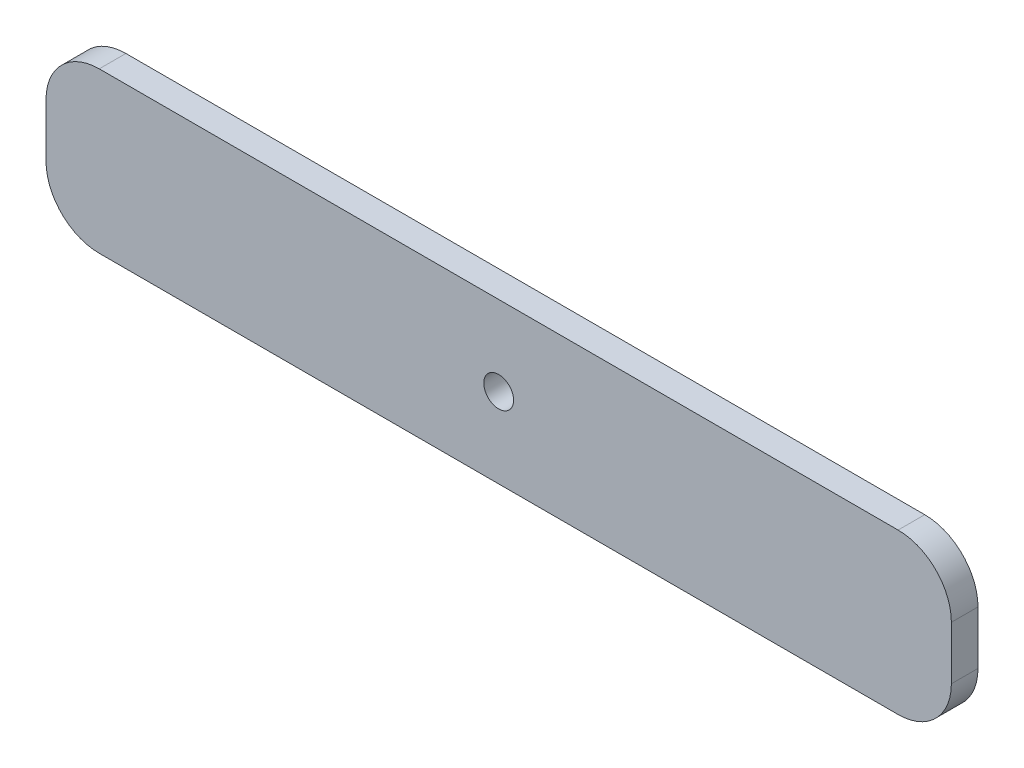
ISO-10303-21;
HEADER;
FILE_DESCRIPTION(('STEP AP214'),'2;1');
FILE_NAME('part.step','',(''),(''),'','','');
FILE_SCHEMA(('AUTOMOTIVE_DESIGN { 1 0 10303 214 1 1 1 1 }'));
ENDSEC;
DATA;
#1=APPLICATION_CONTEXT('core data for automotive mechanical design processes');
#2=APPLICATION_PROTOCOL_DEFINITION('international standard','automotive_design',2000,#1);
#3=PRODUCT_CONTEXT('',#1,'mechanical');
#4=PRODUCT('Part','Part','',(#3));
#5=PRODUCT_RELATED_PRODUCT_CATEGORY('part','',(#4));
#6=PRODUCT_DEFINITION_FORMATION('','',#4);
#7=PRODUCT_DEFINITION_CONTEXT('part definition',#1,'design');
#8=PRODUCT_DEFINITION('design','',#6,#7);
#9=PRODUCT_DEFINITION_SHAPE('','',#8);
#10=(LENGTH_UNIT() NAMED_UNIT(*) SI_UNIT(.MILLI.,.METRE.));
#11=(NAMED_UNIT(*) PLANE_ANGLE_UNIT() SI_UNIT($,.RADIAN.));
#12=(NAMED_UNIT(*) SI_UNIT($,.STERADIAN.) SOLID_ANGLE_UNIT());
#13=UNCERTAINTY_MEASURE_WITH_UNIT(LENGTH_MEASURE(1.E-05),#10,'distance_accuracy_value','');
#14=(GEOMETRIC_REPRESENTATION_CONTEXT(3) GLOBAL_UNCERTAINTY_ASSIGNED_CONTEXT((#13)) GLOBAL_UNIT_ASSIGNED_CONTEXT((#10,
#11,#12)) REPRESENTATION_CONTEXT('',''));
#15=CARTESIAN_POINT('',(0.,0.,0.));
#16=DIRECTION('',(0.,0.,1.));
#17=DIRECTION('',(1.,0.,0.));
#18=AXIS2_PLACEMENT_3D('',#15,#16,#17);
#19=CARTESIAN_POINT('',(10.,-20.,5.));
#20=DIRECTION('',(0.,0.,1.));
#21=DIRECTION('',(1.,0.,0.));
#22=AXIS2_PLACEMENT_3D('',#19,#20,#21);
#23=PLANE('',#22);
#24=CARTESIAN_POINT('',(10.,-20.,5.));
#25=DIRECTION('',(0.,0.,1.));
#26=DIRECTION('',(1.,0.,0.));
#27=AXIS2_PLACEMENT_3D('',#24,#25,#26);
#28=CIRCLE('',#27,10.);
#29=CARTESIAN_POINT('',(0.,-20.,5.));
#30=VERTEX_POINT('',#29);
#31=CARTESIAN_POINT('',(10.,-30.,5.));
#32=VERTEX_POINT('',#31);
#33=EDGE_CURVE('E164',#30,#32,#28,.T.);
#34=ORIENTED_EDGE('',*,*,#33,.T.);
#35=DIRECTION('',(1.,0.,0.));
#36=VECTOR('',#35,1.);
#37=CARTESIAN_POINT('',(10.,-30.,5.));
#38=LINE('',#37,#36);
#39=CARTESIAN_POINT('',(160.,-30.,5.));
#40=VERTEX_POINT('',#39);
#41=EDGE_CURVE('E100',#32,#40,#38,.T.);
#42=ORIENTED_EDGE('',*,*,#41,.T.);
#43=CARTESIAN_POINT('',(160.,-20.,5.));
#44=DIRECTION('',(0.,0.,1.));
#45=DIRECTION('',(1.,0.,0.));
#46=AXIS2_PLACEMENT_3D('',#43,#44,#45);
#47=CIRCLE('',#46,9.99999999999997);
#48=CARTESIAN_POINT('',(170.,-20.,5.));
#49=VERTEX_POINT('',#48);
#50=EDGE_CURVE('E185',#40,#49,#47,.T.);
#51=ORIENTED_EDGE('',*,*,#50,.T.);
#52=DIRECTION('',(0.,1.,0.));
#53=VECTOR('',#52,1.);
#54=CARTESIAN_POINT('',(170.,-10.,5.));
#55=LINE('',#54,#53);
#56=CARTESIAN_POINT('',(170.,-10.,5.));
#57=VERTEX_POINT('',#56);
#58=EDGE_CURVE('E199',#49,#57,#55,.T.);
#59=ORIENTED_EDGE('',*,*,#58,.T.);
#60=CARTESIAN_POINT('',(160.,-10.,5.));
#61=DIRECTION('',(0.,0.,1.));
#62=DIRECTION('',(1.,0.,0.));
#63=AXIS2_PLACEMENT_3D('',#60,#61,#62);
#64=CIRCLE('',#63,10.);
#65=CARTESIAN_POINT('',(160.,0.,5.));
#66=VERTEX_POINT('',#65);
#67=EDGE_CURVE('E119',#57,#66,#64,.T.);
#68=ORIENTED_EDGE('',*,*,#67,.T.);
#69=DIRECTION('',(-1.,0.,0.));
#70=VECTOR('',#69,1.);
#71=CARTESIAN_POINT('',(10.0000000000001,0.,5.));
#72=LINE('',#71,#70);
#73=CARTESIAN_POINT('',(10.0000000000001,0.,5.));
#74=VERTEX_POINT('',#73);
#75=EDGE_CURVE('E113',#66,#74,#72,.T.);
#76=ORIENTED_EDGE('',*,*,#75,.T.);
#77=CARTESIAN_POINT('',(10.,-10.,5.));
#78=DIRECTION('',(0.,0.,1.));
#79=DIRECTION('',(-1.,0.,0.));
#80=AXIS2_PLACEMENT_3D('',#77,#78,#79);
#81=CIRCLE('',#80,10.);
#82=CARTESIAN_POINT('',(0.,-10.0000000000001,5.));
#83=VERTEX_POINT('',#82);
#84=EDGE_CURVE('E117',#74,#83,#81,.T.);
#85=ORIENTED_EDGE('',*,*,#84,.T.);
#86=DIRECTION('',(0.,-1.,0.));
#87=VECTOR('',#86,1.);
#88=CARTESIAN_POINT('',(0.,-10.0000000000001,5.));
#89=LINE('',#88,#87);
#90=EDGE_CURVE('E57',#83,#30,#89,.T.);
#91=ORIENTED_EDGE('',*,*,#90,.T.);
#92=EDGE_LOOP('',(#34,#42,#51,#59,#68,#76,#85,#91));
#93=FACE_BOUND('',#92,.T.);
#94=CARTESIAN_POINT('',(85.,-15.,5.));
#95=DIRECTION('',(0.,0.,1.));
#96=DIRECTION('',(1.,0.,0.));
#97=AXIS2_PLACEMENT_3D('',#94,#95,#96);
#98=CIRCLE('',#97,2.79999999999999);
#99=CARTESIAN_POINT('',(87.8,-15.,5.));
#100=VERTEX_POINT('',#99);
#101=EDGE_CURVE('E146',#100,#100,#98,.T.);
#102=ORIENTED_EDGE('',*,*,#101,.F.);
#103=EDGE_LOOP('',(#102));
#104=FACE_BOUND('',#103,.T.);
#105=ADVANCED_FACE('F39',(#93,#104),#23,.T.);
#106=CARTESIAN_POINT('',(10.,-20.,0.));
#107=DIRECTION('',(0.,0.,1.));
#108=DIRECTION('',(1.,0.,0.));
#109=AXIS2_PLACEMENT_3D('',#106,#107,#108);
#110=PLANE('',#109);
#111=CARTESIAN_POINT('',(10.,-20.,0.));
#112=DIRECTION('',(0.,0.,1.));
#113=DIRECTION('',(1.,0.,0.));
#114=AXIS2_PLACEMENT_3D('',#111,#112,#113);
#115=CIRCLE('',#114,10.);
#116=CARTESIAN_POINT('',(0.,-20.,0.));
#117=VERTEX_POINT('',#116);
#118=CARTESIAN_POINT('',(10.,-30.,0.));
#119=VERTEX_POINT('',#118);
#120=EDGE_CURVE('E141',#117,#119,#115,.T.);
#121=ORIENTED_EDGE('',*,*,#120,.F.);
#122=DIRECTION('',(0.,-1.,0.));
#123=VECTOR('',#122,1.);
#124=CARTESIAN_POINT('',(0.,-10.0000000000001,0.));
#125=LINE('',#124,#123);
#126=CARTESIAN_POINT('',(0.,-10.0000000000001,0.));
#127=VERTEX_POINT('',#126);
#128=EDGE_CURVE('E92',#127,#117,#125,.T.);
#129=ORIENTED_EDGE('',*,*,#128,.F.);
#130=CARTESIAN_POINT('',(10.,-10.,0.));
#131=DIRECTION('',(0.,0.,1.));
#132=DIRECTION('',(-1.,0.,0.));
#133=AXIS2_PLACEMENT_3D('',#130,#131,#132);
#134=CIRCLE('',#133,10.);
#135=CARTESIAN_POINT('',(10.0000000000001,0.,0.));
#136=VERTEX_POINT('',#135);
#137=EDGE_CURVE('E86',#136,#127,#134,.T.);
#138=ORIENTED_EDGE('',*,*,#137,.F.);
#139=DIRECTION('',(-1.,0.,0.));
#140=VECTOR('',#139,1.);
#141=CARTESIAN_POINT('',(10.0000000000001,0.,0.));
#142=LINE('',#141,#140);
#143=CARTESIAN_POINT('',(160.,0.,0.));
#144=VERTEX_POINT('',#143);
#145=EDGE_CURVE('E128',#144,#136,#142,.T.);
#146=ORIENTED_EDGE('',*,*,#145,.F.);
#147=CARTESIAN_POINT('',(160.,-10.,0.));
#148=DIRECTION('',(0.,0.,1.));
#149=DIRECTION('',(1.,0.,0.));
#150=AXIS2_PLACEMENT_3D('',#147,#148,#149);
#151=CIRCLE('',#150,10.);
#152=CARTESIAN_POINT('',(170.,-10.,0.));
#153=VERTEX_POINT('',#152);
#154=EDGE_CURVE('E155',#153,#144,#151,.T.);
#155=ORIENTED_EDGE('',*,*,#154,.F.);
#156=DIRECTION('',(0.,1.,0.));
#157=VECTOR('',#156,1.);
#158=CARTESIAN_POINT('',(170.,-10.,0.));
#159=LINE('',#158,#157);
#160=CARTESIAN_POINT('',(170.,-20.,0.));
#161=VERTEX_POINT('',#160);
#162=EDGE_CURVE('E152',#161,#153,#159,.T.);
#163=ORIENTED_EDGE('',*,*,#162,.F.);
#164=CARTESIAN_POINT('',(160.,-20.,0.));
#165=DIRECTION('',(0.,0.,1.));
#166=DIRECTION('',(1.,0.,0.));
#167=AXIS2_PLACEMENT_3D('',#164,#165,#166);
#168=CIRCLE('',#167,9.99999999999997);
#169=CARTESIAN_POINT('',(160.,-30.,0.));
#170=VERTEX_POINT('',#169);
#171=EDGE_CURVE('E149',#170,#161,#168,.T.);
#172=ORIENTED_EDGE('',*,*,#171,.F.);
#173=DIRECTION('',(1.,0.,0.));
#174=VECTOR('',#173,1.);
#175=CARTESIAN_POINT('',(10.,-30.,0.));
#176=LINE('',#175,#174);
#177=EDGE_CURVE('E145',#119,#170,#176,.T.);
#178=ORIENTED_EDGE('',*,*,#177,.F.);
#179=EDGE_LOOP('',(#121,#129,#138,#146,#155,#163,#172,#178));
#180=FACE_BOUND('',#179,.T.);
#181=CARTESIAN_POINT('',(85.,-15.,0.));
#182=DIRECTION('',(0.,0.,1.));
#183=DIRECTION('',(1.,0.,0.));
#184=AXIS2_PLACEMENT_3D('',#181,#182,#183);
#185=CIRCLE('',#184,2.79999999999999);
#186=CARTESIAN_POINT('',(87.8,-15.,0.));
#187=VERTEX_POINT('',#186);
#188=EDGE_CURVE('E209',#187,#187,#185,.T.);
#189=ORIENTED_EDGE('',*,*,#188,.T.);
#190=EDGE_LOOP('',(#189));
#191=FACE_BOUND('',#190,.T.);
#192=ADVANCED_FACE('F189',(#180,#191),#110,.F.);
#193=CARTESIAN_POINT('',(10.,-20.,5.));
#194=DIRECTION('',(0.,0.,-1.));
#195=DIRECTION('',(-1.,0.,0.));
#196=AXIS2_PLACEMENT_3D('',#193,#194,#195);
#197=CYLINDRICAL_SURFACE('',#196,10.);
#198=ORIENTED_EDGE('',*,*,#120,.T.);
#199=DIRECTION('',(0.,0.,-1.));
#200=VECTOR('',#199,1.);
#201=CARTESIAN_POINT('',(10.,-30.,5.));
#202=LINE('',#201,#200);
#203=EDGE_CURVE('E11',#32,#119,#202,.T.);
#204=ORIENTED_EDGE('',*,*,#203,.F.);
#205=ORIENTED_EDGE('',*,*,#33,.F.);
#206=DIRECTION('',(0.,0.,-1.));
#207=VECTOR('',#206,1.);
#208=CARTESIAN_POINT('',(0.,-20.,5.));
#209=LINE('',#208,#207);
#210=EDGE_CURVE('E137',#30,#117,#209,.T.);
#211=ORIENTED_EDGE('',*,*,#210,.T.);
#212=EDGE_LOOP('',(#198,#204,#205,#211));
#213=FACE_BOUND('',#212,.T.);
#214=ADVANCED_FACE('F41',(#213),#197,.T.);
#215=CARTESIAN_POINT('',(10.,-30.,5.));
#216=DIRECTION('',(0.,1.,0.));
#217=DIRECTION('',(-1.,0.,0.));
#218=AXIS2_PLACEMENT_3D('',#215,#216,#217);
#219=PLANE('',#218);
#220=ORIENTED_EDGE('',*,*,#177,.T.);
#221=DIRECTION('',(0.,0.,-1.));
#222=VECTOR('',#221,1.);
#223=CARTESIAN_POINT('',(160.,-30.,5.));
#224=LINE('',#223,#222);
#225=EDGE_CURVE('E49',#40,#170,#224,.T.);
#226=ORIENTED_EDGE('',*,*,#225,.F.);
#227=ORIENTED_EDGE('',*,*,#41,.F.);
#228=ORIENTED_EDGE('',*,*,#203,.T.);
#229=EDGE_LOOP('',(#220,#226,#227,#228));
#230=FACE_BOUND('',#229,.T.);
#231=ADVANCED_FACE('F239',(#230),#219,.F.);
#232=CARTESIAN_POINT('',(160.,-20.,5.));
#233=DIRECTION('',(0.,0.,-1.));
#234=DIRECTION('',(-1.,0.,0.));
#235=AXIS2_PLACEMENT_3D('',#232,#233,#234);
#236=CYLINDRICAL_SURFACE('',#235,9.99999999999997);
#237=ORIENTED_EDGE('',*,*,#171,.T.);
#238=DIRECTION('',(0.,0.,-1.));
#239=VECTOR('',#238,1.);
#240=CARTESIAN_POINT('',(170.,-20.,5.));
#241=LINE('',#240,#239);
#242=EDGE_CURVE('E175',#49,#161,#241,.T.);
#243=ORIENTED_EDGE('',*,*,#242,.F.);
#244=ORIENTED_EDGE('',*,*,#50,.F.);
#245=ORIENTED_EDGE('',*,*,#225,.T.);
#246=EDGE_LOOP('',(#237,#243,#244,#245));
#247=FACE_BOUND('',#246,.T.);
#248=ADVANCED_FACE('F183',(#247),#236,.T.);
#249=CARTESIAN_POINT('',(170.,-10.,5.));
#250=DIRECTION('',(-1.,0.,0.));
#251=DIRECTION('',(0.,-1.,0.));
#252=AXIS2_PLACEMENT_3D('',#249,#250,#251);
#253=PLANE('',#252);
#254=ORIENTED_EDGE('',*,*,#162,.T.);
#255=DIRECTION('',(0.,0.,-1.));
#256=VECTOR('',#255,1.);
#257=CARTESIAN_POINT('',(170.,-10.,5.));
#258=LINE('',#257,#256);
#259=EDGE_CURVE('E171',#57,#153,#258,.T.);
#260=ORIENTED_EDGE('',*,*,#259,.F.);
#261=ORIENTED_EDGE('',*,*,#58,.F.);
#262=ORIENTED_EDGE('',*,*,#242,.T.);
#263=EDGE_LOOP('',(#254,#260,#261,#262));
#264=FACE_BOUND('',#263,.T.);
#265=ADVANCED_FACE('F194',(#264),#253,.F.);
#266=CARTESIAN_POINT('',(160.,-10.,5.));
#267=DIRECTION('',(0.,0.,-1.));
#268=DIRECTION('',(-1.,0.,0.));
#269=AXIS2_PLACEMENT_3D('',#266,#267,#268);
#270=CYLINDRICAL_SURFACE('',#269,10.);
#271=ORIENTED_EDGE('',*,*,#154,.T.);
#272=DIRECTION('',(0.,0.,-1.));
#273=VECTOR('',#272,1.);
#274=CARTESIAN_POINT('',(160.,0.,5.));
#275=LINE('',#274,#273);
#276=EDGE_CURVE('E130',#66,#144,#275,.T.);
#277=ORIENTED_EDGE('',*,*,#276,.F.);
#278=ORIENTED_EDGE('',*,*,#67,.F.);
#279=ORIENTED_EDGE('',*,*,#259,.T.);
#280=EDGE_LOOP('',(#271,#277,#278,#279));
#281=FACE_BOUND('',#280,.T.);
#282=ADVANCED_FACE('F197',(#281),#270,.T.);
#283=CARTESIAN_POINT('',(10.0000000000001,0.,5.));
#284=DIRECTION('',(0.,-1.,0.));
#285=DIRECTION('',(0.,0.,-1.));
#286=AXIS2_PLACEMENT_3D('',#283,#284,#285);
#287=PLANE('',#286);
#288=ORIENTED_EDGE('',*,*,#145,.T.);
#289=DIRECTION('',(0.,0.,-1.));
#290=VECTOR('',#289,1.);
#291=CARTESIAN_POINT('',(10.0000000000001,0.,5.));
#292=LINE('',#291,#290);
#293=EDGE_CURVE('E125',#74,#136,#292,.T.);
#294=ORIENTED_EDGE('',*,*,#293,.F.);
#295=ORIENTED_EDGE('',*,*,#75,.F.);
#296=ORIENTED_EDGE('',*,*,#276,.T.);
#297=EDGE_LOOP('',(#288,#294,#295,#296));
#298=FACE_BOUND('',#297,.T.);
#299=ADVANCED_FACE('F126',(#298),#287,.F.);
#300=CARTESIAN_POINT('',(10.,-10.,5.));
#301=DIRECTION('',(0.,0.,-1.));
#302=DIRECTION('',(-1.,0.,0.));
#303=AXIS2_PLACEMENT_3D('',#300,#301,#302);
#304=CYLINDRICAL_SURFACE('',#303,10.);
#305=ORIENTED_EDGE('',*,*,#137,.T.);
#306=DIRECTION('',(0.,0.,-1.));
#307=VECTOR('',#306,1.);
#308=CARTESIAN_POINT('',(0.,-10.0000000000001,5.));
#309=LINE('',#308,#307);
#310=EDGE_CURVE('E131',#83,#127,#309,.T.);
#311=ORIENTED_EDGE('',*,*,#310,.F.);
#312=ORIENTED_EDGE('',*,*,#84,.F.);
#313=ORIENTED_EDGE('',*,*,#293,.T.);
#314=EDGE_LOOP('',(#305,#311,#312,#313));
#315=FACE_BOUND('',#314,.T.);
#316=ADVANCED_FACE('F133',(#315),#304,.T.);
#317=CARTESIAN_POINT('',(0.,-10.0000000000001,5.));
#318=DIRECTION('',(1.,0.,0.));
#319=DIRECTION('',(0.,1.,0.));
#320=AXIS2_PLACEMENT_3D('',#317,#318,#319);
#321=PLANE('',#320);
#322=ORIENTED_EDGE('',*,*,#128,.T.);
#323=ORIENTED_EDGE('',*,*,#210,.F.);
#324=ORIENTED_EDGE('',*,*,#90,.F.);
#325=ORIENTED_EDGE('',*,*,#310,.T.);
#326=EDGE_LOOP('',(#322,#323,#324,#325));
#327=FACE_BOUND('',#326,.T.);
#328=ADVANCED_FACE('F227',(#327),#321,.F.);
#329=CARTESIAN_POINT('',(85.,-15.,5.));
#330=DIRECTION('',(0.,0.,-1.));
#331=DIRECTION('',(-1.,0.,0.));
#332=AXIS2_PLACEMENT_3D('',#329,#330,#331);
#333=CYLINDRICAL_SURFACE('',#332,2.79999999999999);
#334=ORIENTED_EDGE('',*,*,#101,.T.);
#335=EDGE_LOOP('',(#334));
#336=FACE_BOUND('',#335,.T.);
#337=ORIENTED_EDGE('',*,*,#188,.F.);
#338=EDGE_LOOP('',(#337));
#339=FACE_BOUND('',#338,.T.);
#340=ADVANCED_FACE('F217',(#336,#339),#333,.F.);
#341=CLOSED_SHELL('',(#105,#192,#214,#231,#248,#265,#282,#299,#316,#328,#340));
#342=MANIFOLD_SOLID_BREP('B2',#341);
#343=ADVANCED_BREP_SHAPE_REPRESENTATION('',(#18,#342),#14);
#344=SHAPE_DEFINITION_REPRESENTATION(#9,#343);
ENDSEC;
END-ISO-10303-21;
